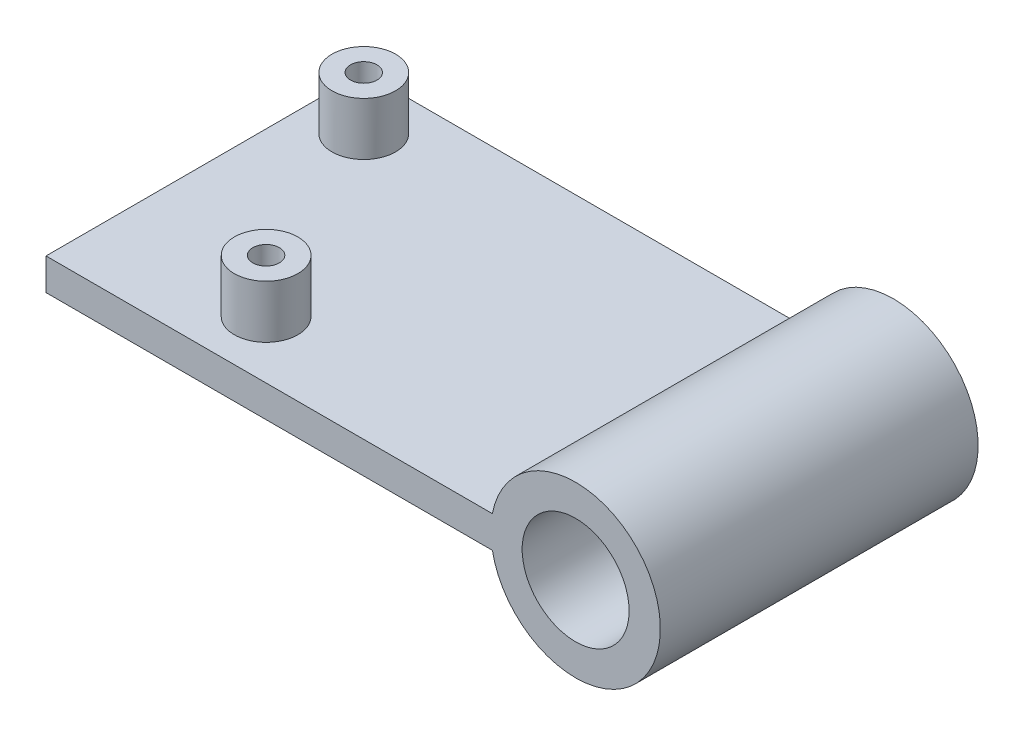
ISO-10303-21;
HEADER;
FILE_DESCRIPTION(('STEP AP214'),'2;1');
FILE_NAME('part.step','',(''),(''),'','','');
FILE_SCHEMA(('AUTOMOTIVE_DESIGN { 1 0 10303 214 1 1 1 1 }'));
ENDSEC;
DATA;
#1=APPLICATION_CONTEXT('core data for automotive mechanical design processes');
#2=APPLICATION_PROTOCOL_DEFINITION('international standard','automotive_design',2000,#1);
#3=PRODUCT_CONTEXT('',#1,'mechanical');
#4=PRODUCT('Part','Part','',(#3));
#5=PRODUCT_RELATED_PRODUCT_CATEGORY('part','',(#4));
#6=PRODUCT_DEFINITION_FORMATION('','',#4);
#7=PRODUCT_DEFINITION_CONTEXT('part definition',#1,'design');
#8=PRODUCT_DEFINITION('design','',#6,#7);
#9=PRODUCT_DEFINITION_SHAPE('','',#8);
#10=(LENGTH_UNIT() NAMED_UNIT(*) SI_UNIT(.MILLI.,.METRE.));
#11=(NAMED_UNIT(*) PLANE_ANGLE_UNIT() SI_UNIT($,.RADIAN.));
#12=(NAMED_UNIT(*) SI_UNIT($,.STERADIAN.) SOLID_ANGLE_UNIT());
#13=UNCERTAINTY_MEASURE_WITH_UNIT(LENGTH_MEASURE(1.E-05),#10,'distance_accuracy_value','');
#14=(GEOMETRIC_REPRESENTATION_CONTEXT(3) GLOBAL_UNCERTAINTY_ASSIGNED_CONTEXT((#13)) GLOBAL_UNIT_ASSIGNED_CONTEXT((#10,
#11,#12)) REPRESENTATION_CONTEXT('',''));
#15=CARTESIAN_POINT('',(0.,0.,0.));
#16=DIRECTION('',(0.,0.,1.));
#17=DIRECTION('',(1.,0.,0.));
#18=AXIS2_PLACEMENT_3D('',#15,#16,#17);
#19=CARTESIAN_POINT('',(0.,0.,30.));
#20=DIRECTION('',(0.,0.,1.));
#21=DIRECTION('',(1.,0.,0.));
#22=AXIS2_PLACEMENT_3D('',#19,#20,#21);
#23=PLANE('',#22);
#24=DIRECTION('',(0.,-1.,0.));
#25=VECTOR('',#24,1.);
#26=CARTESIAN_POINT('',(-50.,1.5,30.));
#27=LINE('',#26,#25);
#28=CARTESIAN_POINT('',(-50.,1.5,30.));
#29=VERTEX_POINT('',#28);
#30=CARTESIAN_POINT('',(-50.,-1.5,30.));
#31=VERTEX_POINT('',#30);
#32=EDGE_CURVE('E105',#29,#31,#27,.T.);
#33=ORIENTED_EDGE('',*,*,#32,.T.);
#34=DIRECTION('',(1.,0.,0.));
#35=VECTOR('',#34,1.);
#36=CARTESIAN_POINT('',(-7.85811682275086,-1.5,30.));
#37=LINE('',#36,#35);
#38=CARTESIAN_POINT('',(-7.85811682275086,-1.5,30.));
#39=VERTEX_POINT('',#38);
#40=EDGE_CURVE('E100',#31,#39,#37,.T.);
#41=ORIENTED_EDGE('',*,*,#40,.T.);
#42=CARTESIAN_POINT('',(0.,0.,30.));
#43=DIRECTION('',(0.,0.,1.));
#44=DIRECTION('',(1.,0.,0.));
#45=AXIS2_PLACEMENT_3D('',#42,#43,#44);
#46=CIRCLE('',#45,8.);
#47=CARTESIAN_POINT('',(-7.85811682275086,1.5,30.));
#48=VERTEX_POINT('',#47);
#49=EDGE_CURVE('E103',#39,#48,#46,.T.);
#50=ORIENTED_EDGE('',*,*,#49,.T.);
#51=DIRECTION('',(-1.,0.,0.));
#52=VECTOR('',#51,1.);
#53=CARTESIAN_POINT('',(-7.85811682275086,1.5,30.));
#54=LINE('',#53,#52);
#55=EDGE_CURVE('E69',#48,#29,#54,.T.);
#56=ORIENTED_EDGE('',*,*,#55,.T.);
#57=EDGE_LOOP('',(#33,#41,#50,#56));
#58=FACE_BOUND('',#57,.T.);
#59=CARTESIAN_POINT('',(0.,0.,30.));
#60=DIRECTION('',(0.,0.,1.));
#61=DIRECTION('',(1.,0.,0.));
#62=AXIS2_PLACEMENT_3D('',#59,#60,#61);
#63=CIRCLE('',#62,5.05);
#64=CARTESIAN_POINT('',(5.05,0.,30.));
#65=VERTEX_POINT('',#64);
#66=EDGE_CURVE('E130',#65,#65,#63,.T.);
#67=ORIENTED_EDGE('',*,*,#66,.F.);
#68=EDGE_LOOP('',(#67));
#69=FACE_BOUND('',#68,.T.);
#70=ADVANCED_FACE('F51',(#58,#69),#23,.T.);
#71=CARTESIAN_POINT('',(0.,0.,0.));
#72=DIRECTION('',(0.,0.,1.));
#73=DIRECTION('',(1.,0.,0.));
#74=AXIS2_PLACEMENT_3D('',#71,#72,#73);
#75=PLANE('',#74);
#76=DIRECTION('',(0.,-1.,0.));
#77=VECTOR('',#76,1.);
#78=CARTESIAN_POINT('',(-50.,1.5,0.));
#79=LINE('',#78,#77);
#80=CARTESIAN_POINT('',(-50.,1.5,0.));
#81=VERTEX_POINT('',#80);
#82=CARTESIAN_POINT('',(-50.,-1.5,0.));
#83=VERTEX_POINT('',#82);
#84=EDGE_CURVE('E126',#81,#83,#79,.T.);
#85=ORIENTED_EDGE('',*,*,#84,.F.);
#86=DIRECTION('',(-1.,0.,0.));
#87=VECTOR('',#86,1.);
#88=CARTESIAN_POINT('',(-7.85811682275086,1.5,0.));
#89=LINE('',#88,#87);
#90=CARTESIAN_POINT('',(-7.85811682275086,1.5,0.));
#91=VERTEX_POINT('',#90);
#92=EDGE_CURVE('E92',#91,#81,#89,.T.);
#93=ORIENTED_EDGE('',*,*,#92,.F.);
#94=CARTESIAN_POINT('',(0.,0.,0.));
#95=DIRECTION('',(0.,0.,1.));
#96=DIRECTION('',(1.,0.,0.));
#97=AXIS2_PLACEMENT_3D('',#94,#95,#96);
#98=CIRCLE('',#97,8.);
#99=CARTESIAN_POINT('',(-7.85811682275086,-1.5,0.));
#100=VERTEX_POINT('',#99);
#101=EDGE_CURVE('E86',#100,#91,#98,.T.);
#102=ORIENTED_EDGE('',*,*,#101,.F.);
#103=DIRECTION('',(1.,0.,0.));
#104=VECTOR('',#103,1.);
#105=CARTESIAN_POINT('',(-7.85811682275086,-1.5,0.));
#106=LINE('',#105,#104);
#107=EDGE_CURVE('E111',#83,#100,#106,.T.);
#108=ORIENTED_EDGE('',*,*,#107,.F.);
#109=EDGE_LOOP('',(#85,#93,#102,#108));
#110=FACE_BOUND('',#109,.T.);
#111=CARTESIAN_POINT('',(0.,0.,0.));
#112=DIRECTION('',(0.,0.,1.));
#113=DIRECTION('',(1.,0.,0.));
#114=AXIS2_PLACEMENT_3D('',#111,#112,#113);
#115=CIRCLE('',#114,5.05);
#116=CARTESIAN_POINT('',(5.05,0.,0.));
#117=VERTEX_POINT('',#116);
#118=EDGE_CURVE('E225',#117,#117,#115,.T.);
#119=ORIENTED_EDGE('',*,*,#118,.T.);
#120=EDGE_LOOP('',(#119));
#121=FACE_BOUND('',#120,.T.);
#122=ADVANCED_FACE('F173',(#110,#121),#75,.F.);
#123=CARTESIAN_POINT('',(-50.,1.5,30.));
#124=DIRECTION('',(1.,0.,0.));
#125=DIRECTION('',(0.,0.,-1.));
#126=AXIS2_PLACEMENT_3D('',#123,#124,#125);
#127=PLANE('',#126);
#128=ORIENTED_EDGE('',*,*,#84,.T.);
#129=DIRECTION('',(0.,0.,-1.));
#130=VECTOR('',#129,1.);
#131=CARTESIAN_POINT('',(-50.,-1.5,30.));
#132=LINE('',#131,#130);
#133=EDGE_CURVE('E113',#31,#83,#132,.T.);
#134=ORIENTED_EDGE('',*,*,#133,.F.);
#135=ORIENTED_EDGE('',*,*,#32,.F.);
#136=DIRECTION('',(0.,0.,-1.));
#137=VECTOR('',#136,1.);
#138=CARTESIAN_POINT('',(-50.,1.5,30.));
#139=LINE('',#138,#137);
#140=EDGE_CURVE('E122',#29,#81,#139,.T.);
#141=ORIENTED_EDGE('',*,*,#140,.T.);
#142=EDGE_LOOP('',(#128,#134,#135,#141));
#143=FACE_BOUND('',#142,.T.);
#144=ADVANCED_FACE('F53',(#143),#127,.F.);
#145=CARTESIAN_POINT('',(-7.85811682275086,-1.5,30.));
#146=DIRECTION('',(0.,1.,0.));
#147=DIRECTION('',(0.,0.,1.));
#148=AXIS2_PLACEMENT_3D('',#145,#146,#147);
#149=PLANE('',#148);
#150=ORIENTED_EDGE('',*,*,#107,.T.);
#151=DIRECTION('',(0.,0.,-1.));
#152=VECTOR('',#151,1.);
#153=CARTESIAN_POINT('',(-7.85811682275086,-1.5,30.));
#154=LINE('',#153,#152);
#155=EDGE_CURVE('E109',#39,#100,#154,.T.);
#156=ORIENTED_EDGE('',*,*,#155,.F.);
#157=ORIENTED_EDGE('',*,*,#40,.F.);
#158=ORIENTED_EDGE('',*,*,#133,.T.);
#159=EDGE_LOOP('',(#150,#156,#157,#158));
#160=FACE_BOUND('',#159,.T.);
#161=ADVANCED_FACE('F110',(#160),#149,.F.);
#162=CARTESIAN_POINT('',(0.,0.,30.));
#163=DIRECTION('',(0.,0.,-1.));
#164=DIRECTION('',(-1.,0.,0.));
#165=AXIS2_PLACEMENT_3D('',#162,#163,#164);
#166=CYLINDRICAL_SURFACE('',#165,8.);
#167=ORIENTED_EDGE('',*,*,#101,.T.);
#168=DIRECTION('',(0.,0.,-1.));
#169=VECTOR('',#168,1.);
#170=CARTESIAN_POINT('',(-7.85811682275086,1.5,30.));
#171=LINE('',#170,#169);
#172=EDGE_CURVE('E114',#48,#91,#171,.T.);
#173=ORIENTED_EDGE('',*,*,#172,.F.);
#174=ORIENTED_EDGE('',*,*,#49,.F.);
#175=ORIENTED_EDGE('',*,*,#155,.T.);
#176=EDGE_LOOP('',(#167,#173,#174,#175));
#177=FACE_BOUND('',#176,.T.);
#178=ADVANCED_FACE('F116',(#177),#166,.T.);
#179=CARTESIAN_POINT('',(-7.85811682275086,1.5,30.));
#180=DIRECTION('',(0.,-1.,0.));
#181=DIRECTION('',(0.,0.,-1.));
#182=AXIS2_PLACEMENT_3D('',#179,#180,#181);
#183=PLANE('',#182);
#184=CARTESIAN_POINT('',(-34.6622,1.5,24.558));
#185=DIRECTION('',(0.,-1.,0.));
#186=DIRECTION('',(0.,0.,-1.));
#187=AXIS2_PLACEMENT_3D('',#184,#185,#186);
#188=CIRCLE('',#187,3.00000000000001);
#189=CARTESIAN_POINT('',(-34.6622,1.5,21.558));
#190=VERTEX_POINT('',#189);
#191=EDGE_CURVE('E11',#190,#190,#188,.F.);
#192=ORIENTED_EDGE('',*,*,#191,.F.);
#193=EDGE_LOOP('',(#192));
#194=FACE_BOUND('',#193,.T.);
#195=CARTESIAN_POINT('',(-45.,1.5,5.));
#196=DIRECTION('',(0.,-1.,0.));
#197=DIRECTION('',(0.,0.,-1.));
#198=AXIS2_PLACEMENT_3D('',#195,#196,#197);
#199=CIRCLE('',#198,3.);
#200=CARTESIAN_POINT('',(-45.,1.5,2.));
#201=VERTEX_POINT('',#200);
#202=EDGE_CURVE('E61',#201,#201,#199,.F.);
#203=ORIENTED_EDGE('',*,*,#202,.F.);
#204=EDGE_LOOP('',(#203));
#205=FACE_BOUND('',#204,.T.);
#206=ORIENTED_EDGE('',*,*,#92,.T.);
#207=ORIENTED_EDGE('',*,*,#140,.F.);
#208=ORIENTED_EDGE('',*,*,#55,.F.);
#209=ORIENTED_EDGE('',*,*,#172,.T.);
#210=EDGE_LOOP('',(#206,#207,#208,#209));
#211=FACE_BOUND('',#210,.T.);
#212=ADVANCED_FACE('F149',(#194,#205,#211),#183,.F.);
#213=CARTESIAN_POINT('',(0.,0.,30.));
#214=DIRECTION('',(0.,0.,-1.));
#215=DIRECTION('',(-1.,0.,0.));
#216=AXIS2_PLACEMENT_3D('',#213,#214,#215);
#217=CYLINDRICAL_SURFACE('',#216,5.05);
#218=ORIENTED_EDGE('',*,*,#66,.T.);
#219=EDGE_LOOP('',(#218));
#220=FACE_BOUND('',#219,.T.);
#221=ORIENTED_EDGE('',*,*,#118,.F.);
#222=EDGE_LOOP('',(#221));
#223=FACE_BOUND('',#222,.T.);
#224=ADVANCED_FACE('F151',(#220,#223),#217,.F.);
#225=CARTESIAN_POINT('',(-45.,6.5,5.));
#226=DIRECTION('',(0.,1.,0.));
#227=DIRECTION('',(0.,0.,1.));
#228=AXIS2_PLACEMENT_3D('',#225,#226,#227);
#229=PLANE('',#228);
#230=CARTESIAN_POINT('',(-45.,6.5,5.));
#231=DIRECTION('',(0.,1.,0.));
#232=DIRECTION('',(0.,0.,1.));
#233=AXIS2_PLACEMENT_3D('',#230,#231,#232);
#234=CIRCLE('',#233,3.);
#235=CARTESIAN_POINT('',(-45.,6.5,8.));
#236=VERTEX_POINT('',#235);
#237=EDGE_CURVE('E219',#236,#236,#234,.T.);
#238=ORIENTED_EDGE('',*,*,#237,.T.);
#239=EDGE_LOOP('',(#238));
#240=FACE_BOUND('',#239,.T.);
#241=CARTESIAN_POINT('',(-45.,6.5,5.));
#242=DIRECTION('',(0.,1.,0.));
#243=DIRECTION('',(0.,0.,1.));
#244=AXIS2_PLACEMENT_3D('',#241,#242,#243);
#245=CIRCLE('',#244,1.25);
#246=CARTESIAN_POINT('',(-45.,6.5,6.25));
#247=VERTEX_POINT('',#246);
#248=EDGE_CURVE('E215',#247,#247,#245,.T.);
#249=ORIENTED_EDGE('',*,*,#248,.F.);
#250=EDGE_LOOP('',(#249));
#251=FACE_BOUND('',#250,.T.);
#252=ADVANCED_FACE('F159',(#240,#251),#229,.T.);
#253=CARTESIAN_POINT('',(-45.,6.5,5.));
#254=DIRECTION('',(0.,-1.,0.));
#255=DIRECTION('',(0.,0.,-1.));
#256=AXIS2_PLACEMENT_3D('',#253,#254,#255);
#257=CYLINDRICAL_SURFACE('',#256,3.);
#258=ORIENTED_EDGE('',*,*,#237,.F.);
#259=EDGE_LOOP('',(#258));
#260=FACE_BOUND('',#259,.T.);
#261=ORIENTED_EDGE('',*,*,#202,.T.);
#262=EDGE_LOOP('',(#261));
#263=FACE_BOUND('',#262,.T.);
#264=ADVANCED_FACE('F147',(#260,#263),#257,.T.);
#265=CARTESIAN_POINT('',(-45.,6.5,5.));
#266=DIRECTION('',(0.,-1.,0.));
#267=DIRECTION('',(0.,0.,-1.));
#268=AXIS2_PLACEMENT_3D('',#265,#266,#267);
#269=CYLINDRICAL_SURFACE('',#268,1.25);
#270=ORIENTED_EDGE('',*,*,#248,.T.);
#271=EDGE_LOOP('',(#270));
#272=FACE_BOUND('',#271,.T.);
#273=CARTESIAN_POINT('',(-45.,1.5,5.));
#274=DIRECTION('',(0.,1.,0.));
#275=DIRECTION('',(0.,0.,1.));
#276=AXIS2_PLACEMENT_3D('',#273,#274,#275);
#277=CIRCLE('',#276,1.25);
#278=CARTESIAN_POINT('',(-45.,1.5,6.25));
#279=VERTEX_POINT('',#278);
#280=EDGE_CURVE('E213',#279,#279,#277,.T.);
#281=ORIENTED_EDGE('',*,*,#280,.F.);
#282=EDGE_LOOP('',(#281));
#283=FACE_BOUND('',#282,.T.);
#284=ADVANCED_FACE('F170',(#272,#283),#269,.F.);
#285=ORIENTED_EDGE('',*,*,#280,.T.);
#286=EDGE_LOOP('',(#285));
#287=FACE_BOUND('',#286,.T.);
#288=ADVANCED_FACE('F155',(#287),#183,.F.);
#289=CARTESIAN_POINT('',(-34.6622,6.5,24.558));
#290=DIRECTION('',(0.,1.,0.));
#291=DIRECTION('',(0.,0.,1.));
#292=AXIS2_PLACEMENT_3D('',#289,#290,#291);
#293=PLANE('',#292);
#294=CARTESIAN_POINT('',(-34.6622,6.5,24.558));
#295=DIRECTION('',(0.,1.,0.));
#296=DIRECTION('',(0.,0.,1.));
#297=AXIS2_PLACEMENT_3D('',#294,#295,#296);
#298=CIRCLE('',#297,3.00000000000001);
#299=CARTESIAN_POINT('',(-34.6622,6.5,27.558));
#300=VERTEX_POINT('',#299);
#301=EDGE_CURVE('E201',#300,#300,#298,.T.);
#302=ORIENTED_EDGE('',*,*,#301,.T.);
#303=EDGE_LOOP('',(#302));
#304=FACE_BOUND('',#303,.T.);
#305=CARTESIAN_POINT('',(-34.6622,6.5,24.558));
#306=DIRECTION('',(0.,1.,0.));
#307=DIRECTION('',(0.,0.,1.));
#308=AXIS2_PLACEMENT_3D('',#305,#306,#307);
#309=CIRCLE('',#308,1.25);
#310=CARTESIAN_POINT('',(-34.6622,6.5,25.808));
#311=VERTEX_POINT('',#310);
#312=EDGE_CURVE('E203',#311,#311,#309,.T.);
#313=ORIENTED_EDGE('',*,*,#312,.F.);
#314=EDGE_LOOP('',(#313));
#315=FACE_BOUND('',#314,.T.);
#316=ADVANCED_FACE('F169',(#304,#315),#293,.T.);
#317=CARTESIAN_POINT('',(-34.6622,6.5,24.558));
#318=DIRECTION('',(0.,-1.,0.));
#319=DIRECTION('',(0.,0.,-1.));
#320=AXIS2_PLACEMENT_3D('',#317,#318,#319);
#321=CYLINDRICAL_SURFACE('',#320,3.00000000000001);
#322=ORIENTED_EDGE('',*,*,#301,.F.);
#323=EDGE_LOOP('',(#322));
#324=FACE_BOUND('',#323,.T.);
#325=ORIENTED_EDGE('',*,*,#191,.T.);
#326=EDGE_LOOP('',(#325));
#327=FACE_BOUND('',#326,.T.);
#328=ADVANCED_FACE('F190',(#324,#327),#321,.T.);
#329=CARTESIAN_POINT('',(-34.6622,6.5,24.558));
#330=DIRECTION('',(0.,-1.,0.));
#331=DIRECTION('',(0.,0.,-1.));
#332=AXIS2_PLACEMENT_3D('',#329,#330,#331);
#333=CYLINDRICAL_SURFACE('',#332,1.25);
#334=ORIENTED_EDGE('',*,*,#312,.T.);
#335=EDGE_LOOP('',(#334));
#336=FACE_BOUND('',#335,.T.);
#337=CARTESIAN_POINT('',(-34.6622,1.5,24.558));
#338=DIRECTION('',(0.,1.,0.));
#339=DIRECTION('',(0.,0.,1.));
#340=AXIS2_PLACEMENT_3D('',#337,#338,#339);
#341=CIRCLE('',#340,1.25);
#342=CARTESIAN_POINT('',(-34.6622,1.5,25.808));
#343=VERTEX_POINT('',#342);
#344=EDGE_CURVE('E208',#343,#343,#341,.T.);
#345=ORIENTED_EDGE('',*,*,#344,.F.);
#346=EDGE_LOOP('',(#345));
#347=FACE_BOUND('',#346,.T.);
#348=ADVANCED_FACE('F166',(#336,#347),#333,.F.);
#349=ORIENTED_EDGE('',*,*,#344,.T.);
#350=EDGE_LOOP('',(#349));
#351=FACE_BOUND('',#350,.T.);
#352=ADVANCED_FACE('F154',(#351),#183,.F.);
#353=CLOSED_SHELL('',(#70,#122,#144,#161,#178,#212,#224,#252,#264,#284,#288,#316,#328,#348,#352));
#354=MANIFOLD_SOLID_BREP('B2',#353);
#355=ADVANCED_BREP_SHAPE_REPRESENTATION('',(#18,#354),#14);
#356=SHAPE_DEFINITION_REPRESENTATION(#9,#355);
ENDSEC;
END-ISO-10303-21;
